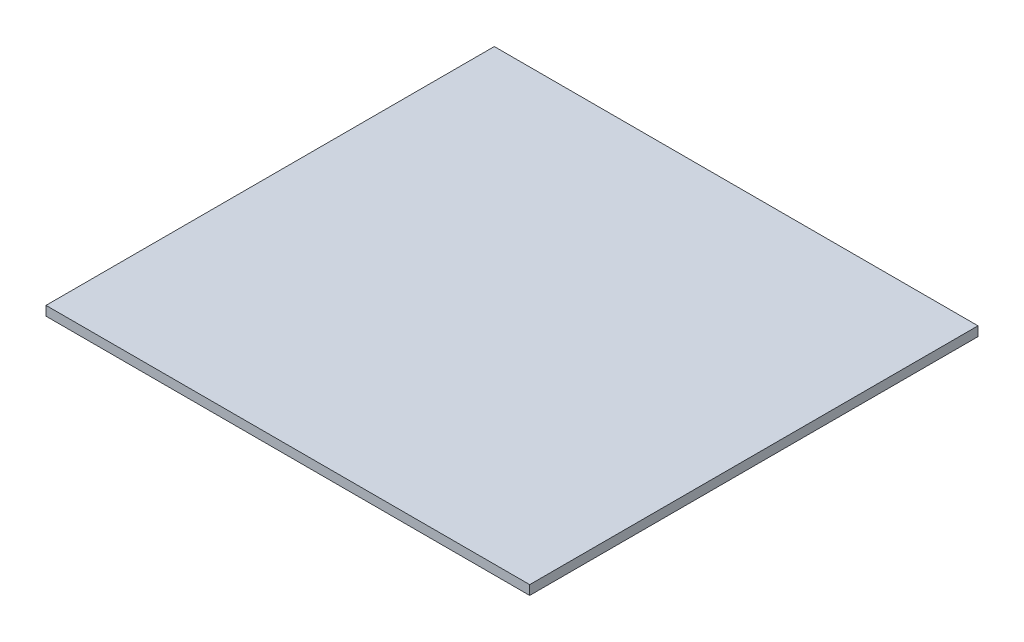
ISO-10303-21;
HEADER;
FILE_DESCRIPTION(('STEP AP214'),'2;1');
FILE_NAME('part.step','',(''),(''),'','','');
FILE_SCHEMA(('AUTOMOTIVE_DESIGN { 1 0 10303 214 1 1 1 1 }'));
ENDSEC;
DATA;
#1=APPLICATION_CONTEXT('core data for automotive mechanical design processes');
#2=APPLICATION_PROTOCOL_DEFINITION('international standard','automotive_design',2000,#1);
#3=PRODUCT_CONTEXT('',#1,'mechanical');
#4=PRODUCT('Part','Part','',(#3));
#5=PRODUCT_RELATED_PRODUCT_CATEGORY('part','',(#4));
#6=PRODUCT_DEFINITION_FORMATION('','',#4);
#7=PRODUCT_DEFINITION_CONTEXT('part definition',#1,'design');
#8=PRODUCT_DEFINITION('design','',#6,#7);
#9=PRODUCT_DEFINITION_SHAPE('','',#8);
#10=(LENGTH_UNIT() NAMED_UNIT(*) SI_UNIT(.MILLI.,.METRE.));
#11=(NAMED_UNIT(*) PLANE_ANGLE_UNIT() SI_UNIT($,.RADIAN.));
#12=(NAMED_UNIT(*) SI_UNIT($,.STERADIAN.) SOLID_ANGLE_UNIT());
#13=UNCERTAINTY_MEASURE_WITH_UNIT(LENGTH_MEASURE(1.E-05),#10,'distance_accuracy_value','');
#14=(GEOMETRIC_REPRESENTATION_CONTEXT(3) GLOBAL_UNCERTAINTY_ASSIGNED_CONTEXT((#13)) GLOBAL_UNIT_ASSIGNED_CONTEXT((#10,
#11,#12)) REPRESENTATION_CONTEXT('',''));
#15=CARTESIAN_POINT('',(0.,0.,0.));
#16=DIRECTION('',(0.,0.,1.));
#17=DIRECTION('',(1.,0.,0.));
#18=AXIS2_PLACEMENT_3D('',#15,#16,#17);
#19=CARTESIAN_POINT('',(-1266.07589588474,40.48125,965.077977864291));
#20=DIRECTION('',(1.,0.,0.));
#21=DIRECTION('',(0.,0.,-1.));
#22=AXIS2_PLACEMENT_3D('',#19,#20,#21);
#23=PLANE('',#22);
#24=DIRECTION('',(0.,0.,1.));
#25=VECTOR('',#24,1.);
#26=CARTESIAN_POINT('',(-1266.07589588474,0.,965.077977864291));
#27=LINE('',#26,#25);
#28=CARTESIAN_POINT('',(-1266.07589588474,0.,-965.322022135709));
#29=VERTEX_POINT('',#28);
#30=CARTESIAN_POINT('',(-1266.07589588474,0.,965.077977864291));
#31=VERTEX_POINT('',#30);
#32=EDGE_CURVE('E107',#29,#31,#27,.T.);
#33=ORIENTED_EDGE('',*,*,#32,.T.);
#34=DIRECTION('',(0.,-1.,0.));
#35=VECTOR('',#34,1.);
#36=CARTESIAN_POINT('',(-1266.07589588474,40.48125,965.077977864291));
#37=LINE('',#36,#35);
#38=CARTESIAN_POINT('',(-1266.07589588474,40.48125,965.077977864291));
#39=VERTEX_POINT('',#38);
#40=EDGE_CURVE('E11',#39,#31,#37,.T.);
#41=ORIENTED_EDGE('',*,*,#40,.F.);
#42=DIRECTION('',(0.,0.,1.));
#43=VECTOR('',#42,1.);
#44=CARTESIAN_POINT('',(-1266.07589588474,40.48125,965.077977864291));
#45=LINE('',#44,#43);
#46=CARTESIAN_POINT('',(-1266.07589588474,40.48125,-965.322022135709));
#47=VERTEX_POINT('',#46);
#48=EDGE_CURVE('E91',#47,#39,#45,.T.);
#49=ORIENTED_EDGE('',*,*,#48,.F.);
#50=DIRECTION('',(0.,-1.,0.));
#51=VECTOR('',#50,1.);
#52=CARTESIAN_POINT('',(-1266.07589588474,40.48125,-965.322022135709));
#53=LINE('',#52,#51);
#54=EDGE_CURVE('E103',#47,#29,#53,.T.);
#55=ORIENTED_EDGE('',*,*,#54,.T.);
#56=EDGE_LOOP('',(#33,#41,#49,#55));
#57=FACE_BOUND('',#56,.T.);
#58=ADVANCED_FACE('F39',(#57),#23,.F.);
#59=CARTESIAN_POINT('',(-1266.07589588474,40.48125,965.077977864291));
#60=DIRECTION('',(0.,0.,-1.));
#61=DIRECTION('',(-1.,0.,0.));
#62=AXIS2_PLACEMENT_3D('',#59,#60,#61);
#63=PLANE('',#62);
#64=DIRECTION('',(1.,0.,0.));
#65=VECTOR('',#64,1.);
#66=CARTESIAN_POINT('',(-1266.07589588474,0.,965.077977864291));
#67=LINE('',#66,#65);
#68=CARTESIAN_POINT('',(816.72410411526,0.,965.077977864291));
#69=VERTEX_POINT('',#68);
#70=EDGE_CURVE('E96',#31,#69,#67,.T.);
#71=ORIENTED_EDGE('',*,*,#70,.T.);
#72=DIRECTION('',(0.,-1.,0.));
#73=VECTOR('',#72,1.);
#74=CARTESIAN_POINT('',(816.72410411526,40.48125,965.077977864291));
#75=LINE('',#74,#73);
#76=CARTESIAN_POINT('',(816.72410411526,40.48125,965.077977864291));
#77=VERTEX_POINT('',#76);
#78=EDGE_CURVE('E48',#77,#69,#75,.T.);
#79=ORIENTED_EDGE('',*,*,#78,.F.);
#80=DIRECTION('',(1.,0.,0.));
#81=VECTOR('',#80,1.);
#82=CARTESIAN_POINT('',(-1266.07589588474,40.48125,965.077977864291));
#83=LINE('',#82,#81);
#84=EDGE_CURVE('E86',#39,#77,#83,.T.);
#85=ORIENTED_EDGE('',*,*,#84,.F.);
#86=ORIENTED_EDGE('',*,*,#40,.T.);
#87=EDGE_LOOP('',(#71,#79,#85,#86));
#88=FACE_BOUND('',#87,.T.);
#89=ADVANCED_FACE('F95',(#88),#63,.F.);
#90=CARTESIAN_POINT('',(816.72410411526,40.48125,965.077977864291));
#91=DIRECTION('',(-1.,0.,0.));
#92=DIRECTION('',(0.,0.,1.));
#93=AXIS2_PLACEMENT_3D('',#90,#91,#92);
#94=PLANE('',#93);
#95=DIRECTION('',(0.,0.,-1.));
#96=VECTOR('',#95,1.);
#97=CARTESIAN_POINT('',(816.72410411526,0.,965.077977864291));
#98=LINE('',#97,#96);
#99=CARTESIAN_POINT('',(816.72410411526,0.,-965.322022135709));
#100=VERTEX_POINT('',#99);
#101=EDGE_CURVE('E73',#69,#100,#98,.T.);
#102=ORIENTED_EDGE('',*,*,#101,.T.);
#103=DIRECTION('',(0.,-1.,0.));
#104=VECTOR('',#103,1.);
#105=CARTESIAN_POINT('',(816.72410411526,40.48125,-965.322022135709));
#106=LINE('',#105,#104);
#107=CARTESIAN_POINT('',(816.72410411526,40.48125,-965.322022135709));
#108=VERTEX_POINT('',#107);
#109=EDGE_CURVE('E98',#108,#100,#106,.T.);
#110=ORIENTED_EDGE('',*,*,#109,.F.);
#111=DIRECTION('',(0.,0.,-1.));
#112=VECTOR('',#111,1.);
#113=CARTESIAN_POINT('',(816.72410411526,40.48125,965.077977864291));
#114=LINE('',#113,#112);
#115=EDGE_CURVE('E89',#77,#108,#114,.T.);
#116=ORIENTED_EDGE('',*,*,#115,.F.);
#117=ORIENTED_EDGE('',*,*,#78,.T.);
#118=EDGE_LOOP('',(#102,#110,#116,#117));
#119=FACE_BOUND('',#118,.T.);
#120=ADVANCED_FACE('F99',(#119),#94,.F.);
#121=CARTESIAN_POINT('',(-1266.07589588474,40.48125,-965.322022135709));
#122=DIRECTION('',(0.,0.,1.));
#123=DIRECTION('',(1.,0.,0.));
#124=AXIS2_PLACEMENT_3D('',#121,#122,#123);
#125=PLANE('',#124);
#126=DIRECTION('',(-1.,0.,0.));
#127=VECTOR('',#126,1.);
#128=CARTESIAN_POINT('',(-1266.07589588474,0.,-965.322022135709));
#129=LINE('',#128,#127);
#130=EDGE_CURVE('E79',#100,#29,#129,.T.);
#131=ORIENTED_EDGE('',*,*,#130,.T.);
#132=ORIENTED_EDGE('',*,*,#54,.F.);
#133=DIRECTION('',(-1.,0.,0.));
#134=VECTOR('',#133,1.);
#135=CARTESIAN_POINT('',(-1266.07589588474,40.48125,-965.322022135709));
#136=LINE('',#135,#134);
#137=EDGE_CURVE('E56',#108,#47,#136,.T.);
#138=ORIENTED_EDGE('',*,*,#137,.F.);
#139=ORIENTED_EDGE('',*,*,#109,.T.);
#140=EDGE_LOOP('',(#131,#132,#138,#139));
#141=FACE_BOUND('',#140,.T.);
#142=ADVANCED_FACE('F120',(#141),#125,.F.);
#143=CARTESIAN_POINT('',(0.,40.48125,0.));
#144=DIRECTION('',(0.,-1.,0.));
#145=DIRECTION('',(0.,0.,-1.));
#146=AXIS2_PLACEMENT_3D('',#143,#144,#145);
#147=PLANE('',#146);
#148=ORIENTED_EDGE('',*,*,#48,.T.);
#149=ORIENTED_EDGE('',*,*,#84,.T.);
#150=ORIENTED_EDGE('',*,*,#115,.T.);
#151=ORIENTED_EDGE('',*,*,#137,.T.);
#152=EDGE_LOOP('',(#148,#149,#150,#151));
#153=FACE_BOUND('',#152,.T.);
#154=ADVANCED_FACE('F87',(#153),#147,.F.);
#155=CARTESIAN_POINT('',(0.,0.,0.));
#156=DIRECTION('',(0.,-1.,0.));
#157=DIRECTION('',(0.,0.,-1.));
#158=AXIS2_PLACEMENT_3D('',#155,#156,#157);
#159=PLANE('',#158);
#160=ORIENTED_EDGE('',*,*,#32,.F.);
#161=ORIENTED_EDGE('',*,*,#130,.F.);
#162=ORIENTED_EDGE('',*,*,#101,.F.);
#163=ORIENTED_EDGE('',*,*,#70,.F.);
#164=EDGE_LOOP('',(#160,#161,#162,#163));
#165=FACE_BOUND('',#164,.T.);
#166=ADVANCED_FACE('F123',(#165),#159,.T.);
#167=CLOSED_SHELL('',(#58,#89,#120,#142,#154,#166));
#168=MANIFOLD_SOLID_BREP('B2',#167);
#169=ADVANCED_BREP_SHAPE_REPRESENTATION('',(#18,#168),#14);
#170=SHAPE_DEFINITION_REPRESENTATION(#9,#169);
ENDSEC;
END-ISO-10303-21;
